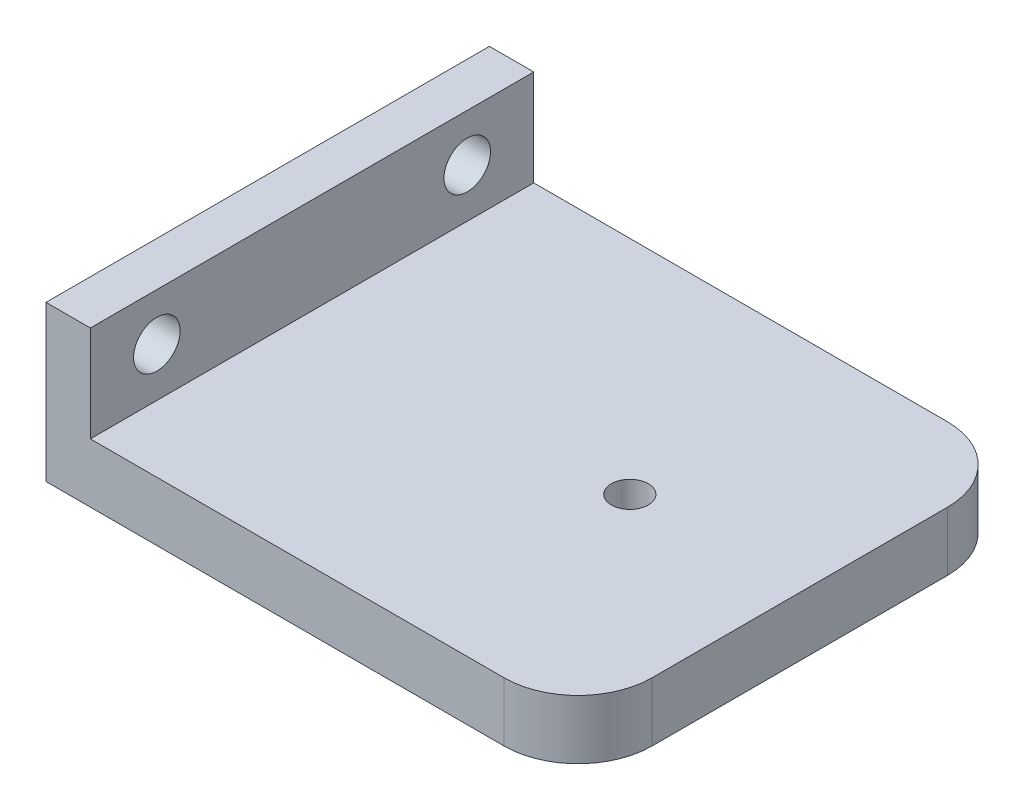
ISO-10303-21;
HEADER;
FILE_DESCRIPTION(('STEP AP214'),'2;1');
FILE_NAME('part.step','',(''),(''),'','','');
FILE_SCHEMA(('AUTOMOTIVE_DESIGN { 1 0 10303 214 1 1 1 1 }'));
ENDSEC;
DATA;
#1=APPLICATION_CONTEXT('core data for automotive mechanical design processes');
#2=APPLICATION_PROTOCOL_DEFINITION('international standard','automotive_design',2000,#1);
#3=PRODUCT_CONTEXT('',#1,'mechanical');
#4=PRODUCT('Part','Part','',(#3));
#5=PRODUCT_RELATED_PRODUCT_CATEGORY('part','',(#4));
#6=PRODUCT_DEFINITION_FORMATION('','',#4);
#7=PRODUCT_DEFINITION_CONTEXT('part definition',#1,'design');
#8=PRODUCT_DEFINITION('design','',#6,#7);
#9=PRODUCT_DEFINITION_SHAPE('','',#8);
#10=(LENGTH_UNIT() NAMED_UNIT(*) SI_UNIT(.MILLI.,.METRE.));
#11=(NAMED_UNIT(*) PLANE_ANGLE_UNIT() SI_UNIT($,.RADIAN.));
#12=(NAMED_UNIT(*) SI_UNIT($,.STERADIAN.) SOLID_ANGLE_UNIT());
#13=UNCERTAINTY_MEASURE_WITH_UNIT(LENGTH_MEASURE(1.E-05),#10,'distance_accuracy_value','');
#14=(GEOMETRIC_REPRESENTATION_CONTEXT(3) GLOBAL_UNCERTAINTY_ASSIGNED_CONTEXT((#13)) GLOBAL_UNIT_ASSIGNED_CONTEXT((#10,
#11,#12)) REPRESENTATION_CONTEXT('',''));
#15=CARTESIAN_POINT('',(0.,0.,0.));
#16=DIRECTION('',(0.,0.,1.));
#17=DIRECTION('',(1.,0.,0.));
#18=AXIS2_PLACEMENT_3D('',#15,#16,#17);
#19=CARTESIAN_POINT('',(3.,0.,0.));
#20=DIRECTION('',(-1.,0.,0.));
#21=DIRECTION('',(0.,0.,1.));
#22=AXIS2_PLACEMENT_3D('',#19,#20,#21);
#23=PLANE('',#22);
#24=CARTESIAN_POINT('',(3.,2.05,-10.5));
#25=DIRECTION('',(1.,0.,0.));
#26=DIRECTION('',(0.,0.,-1.));
#27=AXIS2_PLACEMENT_3D('',#24,#25,#26);
#28=CIRCLE('',#27,1.575);
#29=CARTESIAN_POINT('',(3.,2.05,-12.075));
#30=VERTEX_POINT('',#29);
#31=EDGE_CURVE('E314',#30,#30,#28,.T.);
#32=ORIENTED_EDGE('',*,*,#31,.F.);
#33=EDGE_LOOP('',(#32));
#34=FACE_BOUND('',#33,.T.);
#35=CARTESIAN_POINT('',(3.,2.05,10.5));
#36=DIRECTION('',(1.,0.,0.));
#37=DIRECTION('',(0.,0.,-1.));
#38=AXIS2_PLACEMENT_3D('',#35,#36,#37);
#39=CIRCLE('',#38,1.575);
#40=CARTESIAN_POINT('',(3.,2.05,8.925));
#41=VERTEX_POINT('',#40);
#42=EDGE_CURVE('E127',#41,#41,#39,.T.);
#43=ORIENTED_EDGE('',*,*,#42,.F.);
#44=EDGE_LOOP('',(#43));
#45=FACE_BOUND('',#44,.T.);
#46=DIRECTION('',(0.,0.,1.));
#47=VECTOR('',#46,1.);
#48=CARTESIAN_POINT('',(3.,-1.25,15.));
#49=LINE('',#48,#47);
#50=CARTESIAN_POINT('',(3.,-1.25,-15.));
#51=VERTEX_POINT('',#50);
#52=CARTESIAN_POINT('',(3.,-1.25,15.));
#53=VERTEX_POINT('',#52);
#54=EDGE_CURVE('E112',#51,#53,#49,.T.);
#55=ORIENTED_EDGE('',*,*,#54,.F.);
#56=DIRECTION('',(0.,1.,0.));
#57=VECTOR('',#56,1.);
#58=CARTESIAN_POINT('',(3.,-5.25,-15.));
#59=LINE('',#58,#57);
#60=CARTESIAN_POINT('',(3.,5.25,-15.));
#61=VERTEX_POINT('',#60);
#62=EDGE_CURVE('E133',#51,#61,#59,.T.);
#63=ORIENTED_EDGE('',*,*,#62,.T.);
#64=DIRECTION('',(0.,0.,1.));
#65=VECTOR('',#64,1.);
#66=CARTESIAN_POINT('',(3.,5.25,15.));
#67=LINE('',#66,#65);
#68=CARTESIAN_POINT('',(3.,5.25,15.));
#69=VERTEX_POINT('',#68);
#70=EDGE_CURVE('E115',#61,#69,#67,.T.);
#71=ORIENTED_EDGE('',*,*,#70,.T.);
#72=DIRECTION('',(0.,-1.,0.));
#73=VECTOR('',#72,1.);
#74=CARTESIAN_POINT('',(3.,-5.25,15.));
#75=LINE('',#74,#73);
#76=EDGE_CURVE('E102',#69,#53,#75,.T.);
#77=ORIENTED_EDGE('',*,*,#76,.T.);
#78=EDGE_LOOP('',(#55,#63,#71,#77));
#79=FACE_BOUND('',#78,.T.);
#80=ADVANCED_FACE('F32',(#34,#45,#79),#23,.F.);
#81=CARTESIAN_POINT('',(3.,-5.25,-15.));
#82=DIRECTION('',(0.,0.,1.));
#83=DIRECTION('',(1.,0.,0.));
#84=AXIS2_PLACEMENT_3D('',#81,#82,#83);
#85=PLANE('',#84);
#86=DIRECTION('',(-1.,0.,0.));
#87=VECTOR('',#86,1.);
#88=CARTESIAN_POINT('',(36.,-1.25,-15.));
#89=LINE('',#88,#87);
#90=CARTESIAN_POINT('',(31.,-1.25,-15.));
#91=VERTEX_POINT('',#90);
#92=EDGE_CURVE('E107',#91,#51,#89,.T.);
#93=ORIENTED_EDGE('',*,*,#92,.F.);
#94=DIRECTION('',(0.,1.,0.));
#95=VECTOR('',#94,1.);
#96=CARTESIAN_POINT('',(31.,-5.25,-15.));
#97=LINE('',#96,#95);
#98=CARTESIAN_POINT('',(31.,-5.25,-15.));
#99=VERTEX_POINT('',#98);
#100=EDGE_CURVE('E56',#91,#99,#97,.F.);
#101=ORIENTED_EDGE('',*,*,#100,.T.);
#102=DIRECTION('',(-1.,0.,0.));
#103=VECTOR('',#102,1.);
#104=CARTESIAN_POINT('',(3.,-5.25,-15.));
#105=LINE('',#104,#103);
#106=CARTESIAN_POINT('',(0.,-5.25,-15.));
#107=VERTEX_POINT('',#106);
#108=EDGE_CURVE('E117',#99,#107,#105,.T.);
#109=ORIENTED_EDGE('',*,*,#108,.T.);
#110=DIRECTION('',(0.,1.,0.));
#111=VECTOR('',#110,1.);
#112=CARTESIAN_POINT('',(0.,-5.25,-15.));
#113=LINE('',#112,#111);
#114=CARTESIAN_POINT('',(0.,5.25,-15.));
#115=VERTEX_POINT('',#114);
#116=EDGE_CURVE('E132',#107,#115,#113,.T.);
#117=ORIENTED_EDGE('',*,*,#116,.T.);
#118=DIRECTION('',(-1.,0.,0.));
#119=VECTOR('',#118,1.);
#120=CARTESIAN_POINT('',(3.,5.25,-15.));
#121=LINE('',#120,#119);
#122=EDGE_CURVE('E151',#61,#115,#121,.T.);
#123=ORIENTED_EDGE('',*,*,#122,.F.);
#124=ORIENTED_EDGE('',*,*,#62,.F.);
#125=EDGE_LOOP('',(#93,#101,#109,#117,#123,#124));
#126=FACE_BOUND('',#125,.T.);
#127=ADVANCED_FACE('F175',(#126),#85,.F.);
#128=CARTESIAN_POINT('',(3.,5.25,15.));
#129=DIRECTION('',(0.,-1.,0.));
#130=DIRECTION('',(0.,0.,-1.));
#131=AXIS2_PLACEMENT_3D('',#128,#129,#130);
#132=PLANE('',#131);
#133=DIRECTION('',(0.,0.,1.));
#134=VECTOR('',#133,1.);
#135=CARTESIAN_POINT('',(0.,5.25,15.));
#136=LINE('',#135,#134);
#137=CARTESIAN_POINT('',(0.,5.25,15.));
#138=VERTEX_POINT('',#137);
#139=EDGE_CURVE('E139',#115,#138,#136,.T.);
#140=ORIENTED_EDGE('',*,*,#139,.T.);
#141=DIRECTION('',(-1.,0.,0.));
#142=VECTOR('',#141,1.);
#143=CARTESIAN_POINT('',(3.,5.25,15.));
#144=LINE('',#143,#142);
#145=EDGE_CURVE('E149',#69,#138,#144,.T.);
#146=ORIENTED_EDGE('',*,*,#145,.F.);
#147=ORIENTED_EDGE('',*,*,#70,.F.);
#148=ORIENTED_EDGE('',*,*,#122,.T.);
#149=EDGE_LOOP('',(#140,#146,#147,#148));
#150=FACE_BOUND('',#149,.T.);
#151=ADVANCED_FACE('F178',(#150),#132,.F.);
#152=CARTESIAN_POINT('',(3.,-5.25,15.));
#153=DIRECTION('',(0.,0.,-1.));
#154=DIRECTION('',(-1.,0.,0.));
#155=AXIS2_PLACEMENT_3D('',#152,#153,#154);
#156=PLANE('',#155);
#157=DIRECTION('',(-1.,0.,0.));
#158=VECTOR('',#157,1.);
#159=CARTESIAN_POINT('',(3.,-5.25,15.));
#160=LINE('',#159,#158);
#161=CARTESIAN_POINT('',(31.,-5.25,15.));
#162=VERTEX_POINT('',#161);
#163=CARTESIAN_POINT('',(0.,-5.25,15.));
#164=VERTEX_POINT('',#163);
#165=EDGE_CURVE('E147',#162,#164,#160,.T.);
#166=ORIENTED_EDGE('',*,*,#165,.F.);
#167=DIRECTION('',(0.,-1.,0.));
#168=VECTOR('',#167,1.);
#169=CARTESIAN_POINT('',(31.,-5.25,15.));
#170=LINE('',#169,#168);
#171=CARTESIAN_POINT('',(31.,-1.25,15.));
#172=VERTEX_POINT('',#171);
#173=EDGE_CURVE('E11',#162,#172,#170,.F.);
#174=ORIENTED_EDGE('',*,*,#173,.T.);
#175=DIRECTION('',(-1.,0.,0.));
#176=VECTOR('',#175,1.);
#177=CARTESIAN_POINT('',(36.,-1.25,15.));
#178=LINE('',#177,#176);
#179=EDGE_CURVE('E98',#172,#53,#178,.T.);
#180=ORIENTED_EDGE('',*,*,#179,.T.);
#181=ORIENTED_EDGE('',*,*,#76,.F.);
#182=ORIENTED_EDGE('',*,*,#145,.T.);
#183=DIRECTION('',(0.,-1.,0.));
#184=VECTOR('',#183,1.);
#185=CARTESIAN_POINT('',(0.,-5.25,15.));
#186=LINE('',#185,#184);
#187=EDGE_CURVE('E141',#138,#164,#186,.T.);
#188=ORIENTED_EDGE('',*,*,#187,.T.);
#189=EDGE_LOOP('',(#166,#174,#180,#181,#182,#188));
#190=FACE_BOUND('',#189,.T.);
#191=ADVANCED_FACE('F100',(#190),#156,.F.);
#192=CARTESIAN_POINT('',(3.,-5.25,15.));
#193=DIRECTION('',(0.,1.,0.));
#194=DIRECTION('',(0.,0.,1.));
#195=AXIS2_PLACEMENT_3D('',#192,#193,#194);
#196=PLANE('',#195);
#197=CARTESIAN_POINT('',(24.5,-5.25,0.));
#198=DIRECTION('',(0.,-1.,0.));
#199=DIRECTION('',(0.,0.,-1.));
#200=AXIS2_PLACEMENT_3D('',#197,#198,#199);
#201=CIRCLE('',#200,1.25);
#202=CARTESIAN_POINT('',(24.5,-5.25,-1.25));
#203=VERTEX_POINT('',#202);
#204=EDGE_CURVE('E311',#203,#203,#201,.T.);
#205=ORIENTED_EDGE('',*,*,#204,.F.);
#206=EDGE_LOOP('',(#205));
#207=FACE_BOUND('',#206,.T.);
#208=ORIENTED_EDGE('',*,*,#108,.F.);
#209=CARTESIAN_POINT('',(31.,-5.25,-10.));
#210=DIRECTION('',(0.,1.,0.));
#211=DIRECTION('',(0.,0.,1.));
#212=AXIS2_PLACEMENT_3D('',#209,#210,#211);
#213=CIRCLE('',#212,5.);
#214=CARTESIAN_POINT('',(36.,-5.25,-10.));
#215=VERTEX_POINT('',#214);
#216=EDGE_CURVE('E41',#99,#215,#213,.F.);
#217=ORIENTED_EDGE('',*,*,#216,.T.);
#218=DIRECTION('',(0.,0.,-1.));
#219=VECTOR('',#218,1.);
#220=CARTESIAN_POINT('',(36.,-5.25,15.));
#221=LINE('',#220,#219);
#222=CARTESIAN_POINT('',(36.,-5.25,9.99999999999999));
#223=VERTEX_POINT('',#222);
#224=EDGE_CURVE('E121',#223,#215,#221,.T.);
#225=ORIENTED_EDGE('',*,*,#224,.F.);
#226=CARTESIAN_POINT('',(31.,-5.25,9.99999999999999));
#227=DIRECTION('',(0.,1.,0.));
#228=DIRECTION('',(0.,0.,1.));
#229=AXIS2_PLACEMENT_3D('',#226,#227,#228);
#230=CIRCLE('',#229,5.);
#231=EDGE_CURVE('E48',#223,#162,#230,.F.);
#232=ORIENTED_EDGE('',*,*,#231,.T.);
#233=ORIENTED_EDGE('',*,*,#165,.T.);
#234=DIRECTION('',(0.,0.,-1.));
#235=VECTOR('',#234,1.);
#236=CARTESIAN_POINT('',(0.,-5.25,15.));
#237=LINE('',#236,#235);
#238=EDGE_CURVE('E135',#164,#107,#237,.T.);
#239=ORIENTED_EDGE('',*,*,#238,.T.);
#240=EDGE_LOOP('',(#208,#217,#225,#232,#233,#239));
#241=FACE_BOUND('',#240,.T.);
#242=ADVANCED_FACE('F167',(#207,#241),#196,.F.);
#243=CARTESIAN_POINT('',(0.,0.,0.));
#244=DIRECTION('',(-1.,0.,0.));
#245=DIRECTION('',(0.,0.,1.));
#246=AXIS2_PLACEMENT_3D('',#243,#244,#245);
#247=PLANE('',#246);
#248=CARTESIAN_POINT('',(0.,2.05,-10.5));
#249=DIRECTION('',(1.,0.,0.));
#250=DIRECTION('',(0.,0.,-1.));
#251=AXIS2_PLACEMENT_3D('',#248,#249,#250);
#252=CIRCLE('',#251,1.575);
#253=CARTESIAN_POINT('',(0.,2.05,-12.075));
#254=VERTEX_POINT('',#253);
#255=EDGE_CURVE('E316',#254,#254,#252,.T.);
#256=ORIENTED_EDGE('',*,*,#255,.T.);
#257=EDGE_LOOP('',(#256));
#258=FACE_BOUND('',#257,.T.);
#259=CARTESIAN_POINT('',(0.,2.05,10.5));
#260=DIRECTION('',(1.,0.,0.));
#261=DIRECTION('',(0.,0.,-1.));
#262=AXIS2_PLACEMENT_3D('',#259,#260,#261);
#263=CIRCLE('',#262,1.575);
#264=CARTESIAN_POINT('',(0.,2.05,8.925));
#265=VERTEX_POINT('',#264);
#266=EDGE_CURVE('E122',#265,#265,#263,.T.);
#267=ORIENTED_EDGE('',*,*,#266,.T.);
#268=EDGE_LOOP('',(#267));
#269=FACE_BOUND('',#268,.T.);
#270=ORIENTED_EDGE('',*,*,#116,.F.);
#271=ORIENTED_EDGE('',*,*,#238,.F.);
#272=ORIENTED_EDGE('',*,*,#187,.F.);
#273=ORIENTED_EDGE('',*,*,#139,.F.);
#274=EDGE_LOOP('',(#270,#271,#272,#273));
#275=FACE_BOUND('',#274,.T.);
#276=ADVANCED_FACE('F183',(#258,#269,#275),#247,.T.);
#277=CARTESIAN_POINT('',(36.,-1.25,15.));
#278=DIRECTION('',(0.,-1.,0.));
#279=DIRECTION('',(0.,0.,-1.));
#280=AXIS2_PLACEMENT_3D('',#277,#278,#279);
#281=PLANE('',#280);
#282=CARTESIAN_POINT('',(24.5,-1.25,0.));
#283=DIRECTION('',(0.,-1.,0.));
#284=DIRECTION('',(0.,0.,-1.));
#285=AXIS2_PLACEMENT_3D('',#282,#283,#284);
#286=CIRCLE('',#285,1.25);
#287=CARTESIAN_POINT('',(24.5,-1.25,-1.25));
#288=VERTEX_POINT('',#287);
#289=EDGE_CURVE('E36',#288,#288,#286,.T.);
#290=ORIENTED_EDGE('',*,*,#289,.T.);
#291=EDGE_LOOP('',(#290));
#292=FACE_BOUND('',#291,.T.);
#293=DIRECTION('',(0.,0.,1.));
#294=VECTOR('',#293,1.);
#295=CARTESIAN_POINT('',(36.,-1.25,15.));
#296=LINE('',#295,#294);
#297=CARTESIAN_POINT('',(36.,-1.25,-10.));
#298=VERTEX_POINT('',#297);
#299=CARTESIAN_POINT('',(36.,-1.25,9.99999999999999));
#300=VERTEX_POINT('',#299);
#301=EDGE_CURVE('E108',#298,#300,#296,.T.);
#302=ORIENTED_EDGE('',*,*,#301,.F.);
#303=CARTESIAN_POINT('',(31.,-1.25,-10.));
#304=DIRECTION('',(0.,-1.,0.));
#305=DIRECTION('',(0.,0.,-1.));
#306=AXIS2_PLACEMENT_3D('',#303,#304,#305);
#307=CIRCLE('',#306,5.);
#308=EDGE_CURVE('E162',#298,#91,#307,.F.);
#309=ORIENTED_EDGE('',*,*,#308,.T.);
#310=ORIENTED_EDGE('',*,*,#92,.T.);
#311=ORIENTED_EDGE('',*,*,#54,.T.);
#312=ORIENTED_EDGE('',*,*,#179,.F.);
#313=CARTESIAN_POINT('',(31.,-1.25,9.99999999999999));
#314=DIRECTION('',(0.,-1.,0.));
#315=DIRECTION('',(0.,0.,-1.));
#316=AXIS2_PLACEMENT_3D('',#313,#314,#315);
#317=CIRCLE('',#316,5.);
#318=EDGE_CURVE('E160',#172,#300,#317,.F.);
#319=ORIENTED_EDGE('',*,*,#318,.T.);
#320=EDGE_LOOP('',(#302,#309,#310,#311,#312,#319));
#321=FACE_BOUND('',#320,.T.);
#322=ADVANCED_FACE('F120',(#292,#321),#281,.F.);
#323=CARTESIAN_POINT('',(36.,0.,0.));
#324=DIRECTION('',(-1.,0.,0.));
#325=DIRECTION('',(0.,0.,1.));
#326=AXIS2_PLACEMENT_3D('',#323,#324,#325);
#327=PLANE('',#326);
#328=ORIENTED_EDGE('',*,*,#224,.T.);
#329=DIRECTION('',(0.,1.,0.));
#330=VECTOR('',#329,1.);
#331=CARTESIAN_POINT('',(36.,0.,-10.));
#332=LINE('',#331,#330);
#333=EDGE_CURVE('E157',#215,#298,#332,.T.);
#334=ORIENTED_EDGE('',*,*,#333,.T.);
#335=ORIENTED_EDGE('',*,*,#301,.T.);
#336=DIRECTION('',(0.,-1.,0.));
#337=VECTOR('',#336,1.);
#338=CARTESIAN_POINT('',(36.,0.,9.99999999999999));
#339=LINE('',#338,#337);
#340=EDGE_CURVE('E154',#300,#223,#339,.T.);
#341=ORIENTED_EDGE('',*,*,#340,.T.);
#342=EDGE_LOOP('',(#328,#334,#335,#341));
#343=FACE_BOUND('',#342,.T.);
#344=ADVANCED_FACE('F171',(#343),#327,.F.);
#345=CARTESIAN_POINT('',(31.,0.,-10.));
#346=DIRECTION('',(0.,1.,0.));
#347=DIRECTION('',(0.,0.,1.));
#348=AXIS2_PLACEMENT_3D('',#345,#346,#347);
#349=CYLINDRICAL_SURFACE('',#348,5.);
#350=ORIENTED_EDGE('',*,*,#216,.F.);
#351=ORIENTED_EDGE('',*,*,#100,.F.);
#352=ORIENTED_EDGE('',*,*,#308,.F.);
#353=ORIENTED_EDGE('',*,*,#333,.F.);
#354=EDGE_LOOP('',(#350,#351,#352,#353));
#355=FACE_BOUND('',#354,.T.);
#356=ADVANCED_FACE('F174',(#355),#349,.T.);
#357=CARTESIAN_POINT('',(31.,0.,9.99999999999999));
#358=DIRECTION('',(0.,-1.,0.));
#359=DIRECTION('',(0.,0.,-1.));
#360=AXIS2_PLACEMENT_3D('',#357,#358,#359);
#361=CYLINDRICAL_SURFACE('',#360,5.);
#362=ORIENTED_EDGE('',*,*,#318,.F.);
#363=ORIENTED_EDGE('',*,*,#173,.F.);
#364=ORIENTED_EDGE('',*,*,#231,.F.);
#365=ORIENTED_EDGE('',*,*,#340,.F.);
#366=EDGE_LOOP('',(#362,#363,#364,#365));
#367=FACE_BOUND('',#366,.T.);
#368=ADVANCED_FACE('F34',(#367),#361,.T.);
#369=CARTESIAN_POINT('',(0.,2.05,10.5));
#370=DIRECTION('',(1.,0.,0.));
#371=DIRECTION('',(0.,0.,-1.));
#372=AXIS2_PLACEMENT_3D('',#369,#370,#371);
#373=CYLINDRICAL_SURFACE('',#372,1.575);
#374=ORIENTED_EDGE('',*,*,#266,.F.);
#375=EDGE_LOOP('',(#374));
#376=FACE_BOUND('',#375,.T.);
#377=ORIENTED_EDGE('',*,*,#42,.T.);
#378=EDGE_LOOP('',(#377));
#379=FACE_BOUND('',#378,.T.);
#380=ADVANCED_FACE('F186',(#376,#379),#373,.F.);
#381=CARTESIAN_POINT('',(0.,2.05,-10.5));
#382=DIRECTION('',(1.,0.,0.));
#383=DIRECTION('',(0.,0.,-1.));
#384=AXIS2_PLACEMENT_3D('',#381,#382,#383);
#385=CYLINDRICAL_SURFACE('',#384,1.575);
#386=ORIENTED_EDGE('',*,*,#255,.F.);
#387=EDGE_LOOP('',(#386));
#388=FACE_BOUND('',#387,.T.);
#389=ORIENTED_EDGE('',*,*,#31,.T.);
#390=EDGE_LOOP('',(#389));
#391=FACE_BOUND('',#390,.T.);
#392=ADVANCED_FACE('F191',(#388,#391),#385,.F.);
#393=CARTESIAN_POINT('',(24.5,5.25,0.));
#394=DIRECTION('',(0.,-1.,0.));
#395=DIRECTION('',(0.,0.,-1.));
#396=AXIS2_PLACEMENT_3D('',#393,#394,#395);
#397=CYLINDRICAL_SURFACE('',#396,1.25);
#398=CARTESIAN_POINT('',(24.5,-5.25,-1.25));
#399=CARTESIAN_POINT('',(24.5,-5.20833333333333,-1.25));
#400=CARTESIAN_POINT('',(24.5,-5.16666666666667,-1.25));
#401=CARTESIAN_POINT('',(24.5,-5.08333333333333,-1.25));
#402=CARTESIAN_POINT('',(24.5,-5.04166666666667,-1.25));
#403=CARTESIAN_POINT('',(24.5,-4.95833333333333,-1.25));
#404=CARTESIAN_POINT('',(24.5,-4.91666666666667,-1.25));
#405=CARTESIAN_POINT('',(24.5,-4.83333333333333,-1.25));
#406=CARTESIAN_POINT('',(24.5,-4.79166666666667,-1.25));
#407=CARTESIAN_POINT('',(24.5,-4.70833333333333,-1.25));
#408=CARTESIAN_POINT('',(24.5,-4.66666666666667,-1.25));
#409=CARTESIAN_POINT('',(24.5,-4.58333333333333,-1.25));
#410=CARTESIAN_POINT('',(24.5,-4.54166666666667,-1.25));
#411=CARTESIAN_POINT('',(24.5,-4.45833333333333,-1.25));
#412=CARTESIAN_POINT('',(24.5,-4.41666666666667,-1.25));
#413=CARTESIAN_POINT('',(24.5,-4.33333333333333,-1.25));
#414=CARTESIAN_POINT('',(24.5,-4.29166666666667,-1.25));
#415=CARTESIAN_POINT('',(24.5,-4.20833333333333,-1.25));
#416=CARTESIAN_POINT('',(24.5,-4.16666666666667,-1.25));
#417=CARTESIAN_POINT('',(24.5,-4.08333333333333,-1.25));
#418=CARTESIAN_POINT('',(24.5,-4.04166666666667,-1.25));
#419=CARTESIAN_POINT('',(24.5,-3.95833333333333,-1.25));
#420=CARTESIAN_POINT('',(24.5,-3.91666666666667,-1.25));
#421=CARTESIAN_POINT('',(24.5,-3.83333333333333,-1.25));
#422=CARTESIAN_POINT('',(24.5,-3.79166666666667,-1.25));
#423=CARTESIAN_POINT('',(24.5,-3.70833333333333,-1.25));
#424=CARTESIAN_POINT('',(24.5,-3.66666666666667,-1.25));
#425=CARTESIAN_POINT('',(24.5,-3.58333333333333,-1.25));
#426=CARTESIAN_POINT('',(24.5,-3.54166666666667,-1.25));
#427=CARTESIAN_POINT('',(24.5,-3.45833333333333,-1.25));
#428=CARTESIAN_POINT('',(24.5,-3.41666666666667,-1.25));
#429=CARTESIAN_POINT('',(24.5,-3.33333333333333,-1.25));
#430=CARTESIAN_POINT('',(24.5,-3.29166666666667,-1.25));
#431=CARTESIAN_POINT('',(24.5,-3.20833333333333,-1.25));
#432=CARTESIAN_POINT('',(24.5,-3.16666666666667,-1.25));
#433=CARTESIAN_POINT('',(24.5,-3.08333333333333,-1.25));
#434=CARTESIAN_POINT('',(24.5,-3.04166666666667,-1.25));
#435=CARTESIAN_POINT('',(24.5,-2.95833333333333,-1.25));
#436=CARTESIAN_POINT('',(24.5,-2.91666666666667,-1.25));
#437=CARTESIAN_POINT('',(24.5,-2.83333333333333,-1.25));
#438=CARTESIAN_POINT('',(24.5,-2.79166666666666,-1.25));
#439=CARTESIAN_POINT('',(24.5,-2.70833333333333,-1.25));
#440=CARTESIAN_POINT('',(24.5,-2.66666666666667,-1.25));
#441=CARTESIAN_POINT('',(24.5,-2.58333333333333,-1.25));
#442=CARTESIAN_POINT('',(24.5,-2.54166666666667,-1.25));
#443=CARTESIAN_POINT('',(24.5,-2.45833333333333,-1.25));
#444=CARTESIAN_POINT('',(24.5,-2.41666666666667,-1.25));
#445=CARTESIAN_POINT('',(24.5,-2.33333333333333,-1.25));
#446=CARTESIAN_POINT('',(24.5,-2.29166666666667,-1.25));
#447=CARTESIAN_POINT('',(24.5,-2.20833333333333,-1.25));
#448=CARTESIAN_POINT('',(24.5,-2.16666666666667,-1.25));
#449=CARTESIAN_POINT('',(24.5,-2.08333333333333,-1.25));
#450=CARTESIAN_POINT('',(24.5,-2.04166666666667,-1.25));
#451=CARTESIAN_POINT('',(24.5,-1.95833333333333,-1.25));
#452=CARTESIAN_POINT('',(24.5,-1.91666666666667,-1.25));
#453=CARTESIAN_POINT('',(24.5,-1.83333333333333,-1.25));
#454=CARTESIAN_POINT('',(24.5,-1.79166666666667,-1.25));
#455=CARTESIAN_POINT('',(24.5,-1.70833333333333,-1.25));
#456=CARTESIAN_POINT('',(24.5,-1.66666666666667,-1.25));
#457=CARTESIAN_POINT('',(24.5,-1.58333333333333,-1.25));
#458=CARTESIAN_POINT('',(24.5,-1.54166666666667,-1.25));
#459=CARTESIAN_POINT('',(24.5,-1.45833333333333,-1.25));
#460=CARTESIAN_POINT('',(24.5,-1.41666666666667,-1.25));
#461=CARTESIAN_POINT('',(24.5,-1.33333333333333,-1.25));
#462=CARTESIAN_POINT('',(24.5,-1.29166666666667,-1.25));
#463=CARTESIAN_POINT('',(24.5,-1.25,-1.25));
#464=B_SPLINE_CURVE_WITH_KNOTS('',3,(#398,#399,#400,#401,#402,#403,#404,#405,#406,#407,#408,
#409,#410,#411,#412,#413,#414,#415,#416,#417,#418,#419,#420,#421,#422,#423,#424,#425,#426,#427,
#428,#429,#430,#431,#432,#433,#434,#435,#436,#437,#438,#439,#440,#441,#442,#443,#444,#445,#446,
#447,#448,#449,#450,#451,#452,#453,#454,#455,#456,#457,#458,#459,#460,#461,#462,#463),
.UNSPECIFIED.,.F.,.F.,(4,2,2,2,2,2,2,2,2,2,2,2,2,2,2,2,2,2,2,2,2,2,2,2,2,2,2,2,2,2,2,2,4),(0.,
0.125,0.25,0.375,0.5,0.625000000000001,0.750000000000001,0.875000000000001,1.,1.125,1.25,1.375,
1.5,1.625,1.75,1.875,2.,2.125,2.25,2.375,2.5,2.625,2.75,2.875,3.,3.125,3.25,3.375,3.5,3.625,
3.75,3.875,4.),.UNSPECIFIED.);
#465=EDGE_CURVE('BSEAM295',#203,#288,#464,.T.);
#466=ORIENTED_EDGE('',*,*,#204,.T.);
#467=ORIENTED_EDGE('',*,*,#289,.F.);
#468=ORIENTED_EDGE('',*,*,#465,.T.);
#469=ORIENTED_EDGE('',*,*,#465,.F.);
#470=EDGE_LOOP('',(#466,#468,#467,#469));
#471=FACE_BOUND('',#470,.T.);
#472=ADVANCED_FACE('F295',(#471),#397,.F.);
#473=CLOSED_SHELL('',(#80,#127,#151,#191,#242,#276,#322,#344,#356,#368,#380,#392,#472));
#474=MANIFOLD_SOLID_BREP('B2',#473);
#475=ADVANCED_BREP_SHAPE_REPRESENTATION('',(#18,#474),#14);
#476=SHAPE_DEFINITION_REPRESENTATION(#9,#475);
ENDSEC;
END-ISO-10303-21;
